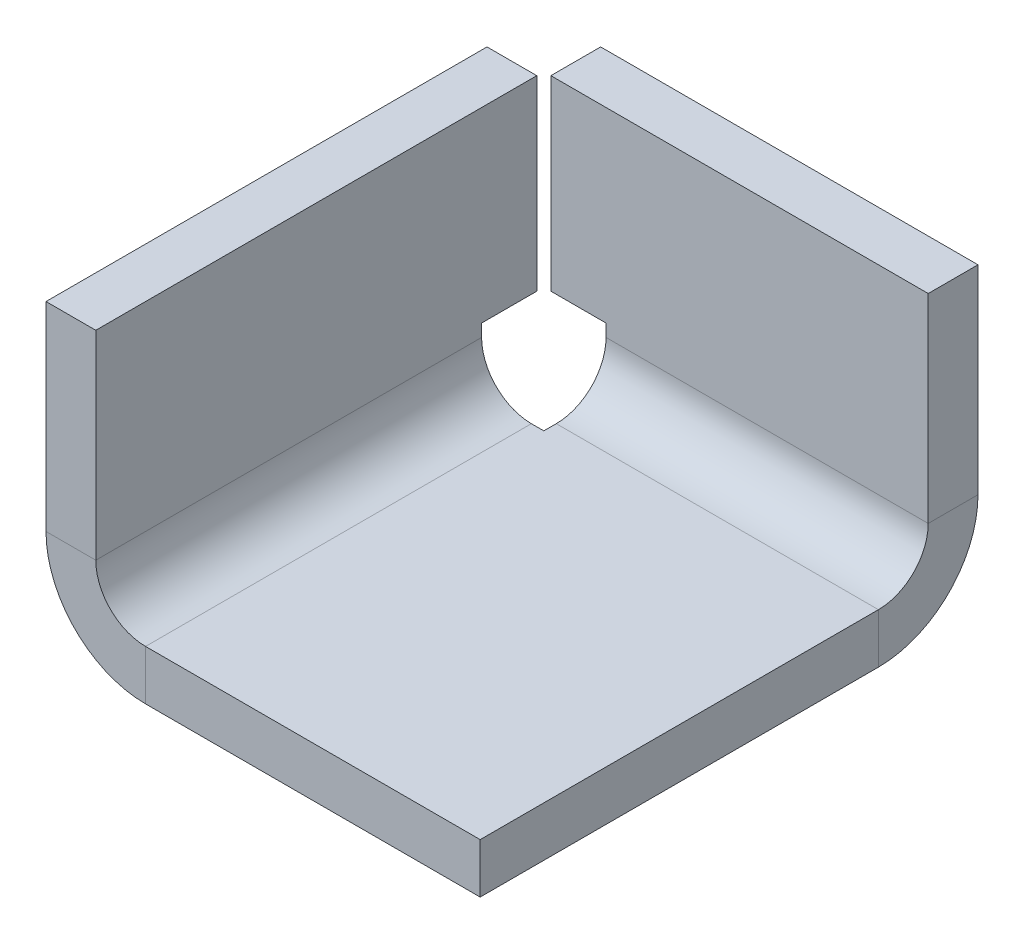
ISO-10303-21;
HEADER;
FILE_DESCRIPTION(('STEP AP214'),'2;1');
FILE_NAME('part.step','',(''),(''),'','','');
FILE_SCHEMA(('AUTOMOTIVE_DESIGN { 1 0 10303 214 1 1 1 1 }'));
ENDSEC;
DATA;
#1=APPLICATION_CONTEXT('core data for automotive mechanical design processes');
#2=APPLICATION_PROTOCOL_DEFINITION('international standard','automotive_design',2000,#1);
#3=PRODUCT_CONTEXT('',#1,'mechanical');
#4=PRODUCT('Part','Part','',(#3));
#5=PRODUCT_RELATED_PRODUCT_CATEGORY('part','',(#4));
#6=PRODUCT_DEFINITION_FORMATION('','',#4);
#7=PRODUCT_DEFINITION_CONTEXT('part definition',#1,'design');
#8=PRODUCT_DEFINITION('design','',#6,#7);
#9=PRODUCT_DEFINITION_SHAPE('','',#8);
#10=(LENGTH_UNIT() NAMED_UNIT(*) SI_UNIT(.MILLI.,.METRE.));
#11=(NAMED_UNIT(*) PLANE_ANGLE_UNIT() SI_UNIT($,.RADIAN.));
#12=(NAMED_UNIT(*) SI_UNIT($,.STERADIAN.) SOLID_ANGLE_UNIT());
#13=UNCERTAINTY_MEASURE_WITH_UNIT(LENGTH_MEASURE(1.E-05),#10,'distance_accuracy_value','');
#14=(GEOMETRIC_REPRESENTATION_CONTEXT(3) GLOBAL_UNCERTAINTY_ASSIGNED_CONTEXT((#13)) GLOBAL_UNIT_ASSIGNED_CONTEXT((#10,
#11,#12)) REPRESENTATION_CONTEXT('',''));
#15=CARTESIAN_POINT('',(0.,0.,0.));
#16=DIRECTION('',(0.,0.,1.));
#17=DIRECTION('',(1.,0.,0.));
#18=AXIS2_PLACEMENT_3D('',#15,#16,#17);
#19=CARTESIAN_POINT('',(22.4999999999999,0.,100.));
#20=DIRECTION('',(1.,0.,0.));
#21=DIRECTION('',(0.,0.,-1.));
#22=AXIS2_PLACEMENT_3D('',#19,#20,#21);
#23=PLANE('',#22);
#24=DIRECTION('',(0.,1.,0.));
#25=VECTOR('',#24,1.);
#26=CARTESIAN_POINT('',(22.4999999999999,0.,20.));
#27=LINE('',#26,#25);
#28=CARTESIAN_POINT('',(22.4999999999999,-10.,20.));
#29=VERTEX_POINT('',#28);
#30=CARTESIAN_POINT('',(22.4999999999999,0.,20.));
#31=VERTEX_POINT('',#30);
#32=EDGE_CURVE('E11',#29,#31,#27,.T.);
#33=ORIENTED_EDGE('',*,*,#32,.F.);
#34=DIRECTION('',(0.,0.,1.));
#35=VECTOR('',#34,1.);
#36=CARTESIAN_POINT('',(22.4999999999999,-10.,100.));
#37=LINE('',#36,#35);
#38=CARTESIAN_POINT('',(22.4999999999999,-10.,22.4999999999999));
#39=VERTEX_POINT('',#38);
#40=EDGE_CURVE('E118',#39,#29,#37,.F.);
#41=ORIENTED_EDGE('',*,*,#40,.F.);
#42=DIRECTION('',(0.,1.,0.));
#43=VECTOR('',#42,1.);
#44=CARTESIAN_POINT('',(22.4999999999999,0.,22.4999999999999));
#45=LINE('',#44,#43);
#46=CARTESIAN_POINT('',(22.4999999999999,0.,22.4999999999999));
#47=VERTEX_POINT('',#46);
#48=EDGE_CURVE('E48',#39,#47,#45,.T.);
#49=ORIENTED_EDGE('',*,*,#48,.T.);
#50=DIRECTION('',(0.,0.,-1.));
#51=VECTOR('',#50,1.);
#52=CARTESIAN_POINT('',(22.4999999999999,0.,100.));
#53=LINE('',#52,#51);
#54=EDGE_CURVE('E121',#47,#31,#53,.T.);
#55=ORIENTED_EDGE('',*,*,#54,.T.);
#56=EDGE_LOOP('',(#33,#41,#49,#55));
#57=FACE_BOUND('',#56,.T.);
#58=ADVANCED_FACE('F38',(#57),#23,.F.);
#59=CARTESIAN_POINT('',(0.,0.,22.4999999999999));
#60=DIRECTION('',(0.,0.,1.));
#61=DIRECTION('',(1.,0.,0.));
#62=AXIS2_PLACEMENT_3D('',#59,#60,#61);
#63=PLANE('',#62);
#64=ORIENTED_EDGE('',*,*,#48,.F.);
#65=DIRECTION('',(1.,0.,0.));
#66=VECTOR('',#65,1.);
#67=CARTESIAN_POINT('',(0.,-10.,22.4999999999999));
#68=LINE('',#67,#66);
#69=CARTESIAN_POINT('',(20.,-10.,22.4999999999999));
#70=VERTEX_POINT('',#69);
#71=EDGE_CURVE('E148',#70,#39,#68,.T.);
#72=ORIENTED_EDGE('',*,*,#71,.F.);
#73=DIRECTION('',(0.,1.,0.));
#74=VECTOR('',#73,1.);
#75=CARTESIAN_POINT('',(20.,0.,22.4999999999999));
#76=LINE('',#75,#74);
#77=CARTESIAN_POINT('',(20.,0.,22.4999999999999));
#78=VERTEX_POINT('',#77);
#79=EDGE_CURVE('E203',#70,#78,#76,.T.);
#80=ORIENTED_EDGE('',*,*,#79,.T.);
#81=DIRECTION('',(1.,0.,0.));
#82=VECTOR('',#81,1.);
#83=CARTESIAN_POINT('',(0.,0.,22.4999999999999));
#84=LINE('',#83,#82);
#85=EDGE_CURVE('E215',#78,#47,#84,.T.);
#86=ORIENTED_EDGE('',*,*,#85,.T.);
#87=EDGE_LOOP('',(#64,#72,#80,#86));
#88=FACE_BOUND('',#87,.T.);
#89=ADVANCED_FACE('F222',(#88),#63,.F.);
#90=CARTESIAN_POINT('',(20.,9.99999999999999,22.4999999999999));
#91=DIRECTION('',(0.,0.,1.));
#92=DIRECTION('',(1.,0.,0.));
#93=AXIS2_PLACEMENT_3D('',#90,#91,#92);
#94=PLANE('',#93);
#95=ORIENTED_EDGE('',*,*,#79,.F.);
#96=CARTESIAN_POINT('',(20.,9.99999999999999,22.4999999999999));
#97=DIRECTION('',(0.,0.,-1.));
#98=DIRECTION('',(-1.,0.,0.));
#99=AXIS2_PLACEMENT_3D('',#96,#97,#98);
#100=CIRCLE('',#99,20.);
#101=CARTESIAN_POINT('',(0.,9.99999999999999,22.4999999999999));
#102=VERTEX_POINT('',#101);
#103=EDGE_CURVE('E279',#70,#102,#100,.T.);
#104=ORIENTED_EDGE('',*,*,#103,.T.);
#105=DIRECTION('',(1.,0.,0.));
#106=VECTOR('',#105,1.);
#107=CARTESIAN_POINT('',(10.,9.99999999999999,22.4999999999999));
#108=LINE('',#107,#106);
#109=CARTESIAN_POINT('',(10.,9.99999999999999,22.4999999999999));
#110=VERTEX_POINT('',#109);
#111=EDGE_CURVE('E200',#102,#110,#108,.T.);
#112=ORIENTED_EDGE('',*,*,#111,.T.);
#113=CARTESIAN_POINT('',(20.,9.99999999999999,22.4999999999999));
#114=DIRECTION('',(0.,0.,-1.));
#115=DIRECTION('',(-1.,0.,0.));
#116=AXIS2_PLACEMENT_3D('',#113,#114,#115);
#117=CIRCLE('',#116,10.);
#118=EDGE_CURVE('E249',#78,#110,#117,.T.);
#119=ORIENTED_EDGE('',*,*,#118,.F.);
#120=EDGE_LOOP('',(#95,#104,#112,#119));
#121=FACE_BOUND('',#120,.T.);
#122=ADVANCED_FACE('F293',(#121),#94,.F.);
#123=CARTESIAN_POINT('',(10.,50.,22.4999999999999));
#124=DIRECTION('',(0.,0.,1.));
#125=DIRECTION('',(0.,1.,0.));
#126=AXIS2_PLACEMENT_3D('',#123,#124,#125);
#127=PLANE('',#126);
#128=ORIENTED_EDGE('',*,*,#111,.F.);
#129=DIRECTION('',(0.,1.,0.));
#130=VECTOR('',#129,1.);
#131=CARTESIAN_POINT('',(0.,50.,22.4999999999999));
#132=LINE('',#131,#130);
#133=CARTESIAN_POINT('',(0.,12.4999999999999,22.4999999999999));
#134=VERTEX_POINT('',#133);
#135=EDGE_CURVE('E287',#102,#134,#132,.T.);
#136=ORIENTED_EDGE('',*,*,#135,.T.);
#137=DIRECTION('',(1.,0.,0.));
#138=VECTOR('',#137,1.);
#139=CARTESIAN_POINT('',(10.,12.4999999999999,22.4999999999999));
#140=LINE('',#139,#138);
#141=CARTESIAN_POINT('',(10.,12.4999999999999,22.4999999999999));
#142=VERTEX_POINT('',#141);
#143=EDGE_CURVE('E197',#134,#142,#140,.T.);
#144=ORIENTED_EDGE('',*,*,#143,.T.);
#145=DIRECTION('',(0.,1.,0.));
#146=VECTOR('',#145,1.);
#147=CARTESIAN_POINT('',(10.,50.,22.4999999999999));
#148=LINE('',#147,#146);
#149=EDGE_CURVE('E223',#110,#142,#148,.T.);
#150=ORIENTED_EDGE('',*,*,#149,.F.);
#151=EDGE_LOOP('',(#128,#136,#144,#150));
#152=FACE_BOUND('',#151,.T.);
#153=ADVANCED_FACE('F307',(#152),#127,.F.);
#154=CARTESIAN_POINT('',(10.,12.4999999999999,100.));
#155=DIRECTION('',(0.,-1.,0.));
#156=DIRECTION('',(0.,0.,1.));
#157=AXIS2_PLACEMENT_3D('',#154,#155,#156);
#158=PLANE('',#157);
#159=ORIENTED_EDGE('',*,*,#143,.F.);
#160=DIRECTION('',(0.,0.,1.));
#161=VECTOR('',#160,1.);
#162=CARTESIAN_POINT('',(0.,12.4999999999999,100.));
#163=LINE('',#162,#161);
#164=CARTESIAN_POINT('',(0.,12.4999999999999,11.4142135623731));
#165=VERTEX_POINT('',#164);
#166=EDGE_CURVE('E284',#165,#134,#163,.T.);
#167=ORIENTED_EDGE('',*,*,#166,.F.);
#168=DIRECTION('',(1.,0.,0.));
#169=VECTOR('',#168,1.);
#170=CARTESIAN_POINT('',(10.,12.4999999999999,11.4142135623731));
#171=LINE('',#170,#169);
#172=CARTESIAN_POINT('',(10.,12.4999999999999,11.4142135623731));
#173=VERTEX_POINT('',#172);
#174=EDGE_CURVE('E194',#165,#173,#171,.T.);
#175=ORIENTED_EDGE('',*,*,#174,.T.);
#176=DIRECTION('',(0.,0.,1.));
#177=VECTOR('',#176,1.);
#178=CARTESIAN_POINT('',(10.,12.4999999999999,100.));
#179=LINE('',#178,#177);
#180=EDGE_CURVE('E226',#173,#142,#179,.T.);
#181=ORIENTED_EDGE('',*,*,#180,.T.);
#182=EDGE_LOOP('',(#159,#167,#175,#181));
#183=FACE_BOUND('',#182,.T.);
#184=ADVANCED_FACE('F373',(#183),#158,.T.);
#185=CARTESIAN_POINT('',(10.,50.,11.4142135623731));
#186=DIRECTION('',(0.,0.,1.));
#187=DIRECTION('',(0.,1.,0.));
#188=AXIS2_PLACEMENT_3D('',#185,#186,#187);
#189=PLANE('',#188);
#190=ORIENTED_EDGE('',*,*,#174,.F.);
#191=DIRECTION('',(0.,1.,0.));
#192=VECTOR('',#191,1.);
#193=CARTESIAN_POINT('',(0.,50.,11.4142135623731));
#194=LINE('',#193,#192);
#195=CARTESIAN_POINT('',(0.,50.,11.4142135623731));
#196=VERTEX_POINT('',#195);
#197=EDGE_CURVE('E266',#165,#196,#194,.T.);
#198=ORIENTED_EDGE('',*,*,#197,.T.);
#199=DIRECTION('',(1.,0.,0.));
#200=VECTOR('',#199,1.);
#201=CARTESIAN_POINT('',(10.,50.,11.4142135623731));
#202=LINE('',#201,#200);
#203=CARTESIAN_POINT('',(10.,50.,11.4142135623731));
#204=VERTEX_POINT('',#203);
#205=EDGE_CURVE('E191',#196,#204,#202,.T.);
#206=ORIENTED_EDGE('',*,*,#205,.T.);
#207=DIRECTION('',(0.,1.,0.));
#208=VECTOR('',#207,1.);
#209=CARTESIAN_POINT('',(10.,50.,11.4142135623731));
#210=LINE('',#209,#208);
#211=EDGE_CURVE('E352',#173,#204,#210,.T.);
#212=ORIENTED_EDGE('',*,*,#211,.F.);
#213=EDGE_LOOP('',(#190,#198,#206,#212));
#214=FACE_BOUND('',#213,.T.);
#215=ADVANCED_FACE('F375',(#214),#189,.F.);
#216=CARTESIAN_POINT('',(10.,50.,100.));
#217=DIRECTION('',(0.,-1.,0.));
#218=DIRECTION('',(0.,0.,1.));
#219=AXIS2_PLACEMENT_3D('',#216,#217,#218);
#220=PLANE('',#219);
#221=ORIENTED_EDGE('',*,*,#205,.F.);
#222=DIRECTION('',(0.,0.,1.));
#223=VECTOR('',#222,1.);
#224=CARTESIAN_POINT('',(0.,50.,100.));
#225=LINE('',#224,#223);
#226=CARTESIAN_POINT('',(0.,50.,100.));
#227=VERTEX_POINT('',#226);
#228=EDGE_CURVE('E154',#227,#196,#225,.F.);
#229=ORIENTED_EDGE('',*,*,#228,.F.);
#230=DIRECTION('',(1.,0.,0.));
#231=VECTOR('',#230,1.);
#232=CARTESIAN_POINT('',(10.,50.,100.));
#233=LINE('',#232,#231);
#234=CARTESIAN_POINT('',(10.,50.,100.));
#235=VERTEX_POINT('',#234);
#236=EDGE_CURVE('E188',#227,#235,#233,.T.);
#237=ORIENTED_EDGE('',*,*,#236,.T.);
#238=DIRECTION('',(0.,0.,1.));
#239=VECTOR('',#238,1.);
#240=CARTESIAN_POINT('',(10.,50.,100.));
#241=LINE('',#240,#239);
#242=EDGE_CURVE('E244',#235,#204,#241,.F.);
#243=ORIENTED_EDGE('',*,*,#242,.T.);
#244=EDGE_LOOP('',(#221,#229,#237,#243));
#245=FACE_BOUND('',#244,.T.);
#246=ADVANCED_FACE('F349',(#245),#220,.F.);
#247=CARTESIAN_POINT('',(10.,50.,100.));
#248=DIRECTION('',(0.,0.,-1.));
#249=DIRECTION('',(0.,-1.,0.));
#250=AXIS2_PLACEMENT_3D('',#247,#248,#249);
#251=PLANE('',#250);
#252=ORIENTED_EDGE('',*,*,#236,.F.);
#253=DIRECTION('',(0.,1.,0.));
#254=VECTOR('',#253,1.);
#255=CARTESIAN_POINT('',(0.,50.,100.));
#256=LINE('',#255,#254);
#257=CARTESIAN_POINT('',(0.,9.99999999999999,100.));
#258=VERTEX_POINT('',#257);
#259=EDGE_CURVE('E157',#227,#258,#256,.F.);
#260=ORIENTED_EDGE('',*,*,#259,.T.);
#261=DIRECTION('',(1.,0.,0.));
#262=VECTOR('',#261,1.);
#263=CARTESIAN_POINT('',(10.,9.99999999999999,100.));
#264=LINE('',#263,#262);
#265=CARTESIAN_POINT('',(10.,9.99999999999999,100.));
#266=VERTEX_POINT('',#265);
#267=EDGE_CURVE('E185',#258,#266,#264,.T.);
#268=ORIENTED_EDGE('',*,*,#267,.T.);
#269=DIRECTION('',(0.,-1.,0.));
#270=VECTOR('',#269,1.);
#271=CARTESIAN_POINT('',(10.,50.,100.));
#272=LINE('',#271,#270);
#273=EDGE_CURVE('E319',#235,#266,#272,.T.);
#274=ORIENTED_EDGE('',*,*,#273,.F.);
#275=EDGE_LOOP('',(#252,#260,#268,#274));
#276=FACE_BOUND('',#275,.T.);
#277=ADVANCED_FACE('F354',(#276),#251,.F.);
#278=CARTESIAN_POINT('',(20.,9.99999999999999,100.));
#279=DIRECTION('',(0.,0.,1.));
#280=DIRECTION('',(1.,0.,0.));
#281=AXIS2_PLACEMENT_3D('',#278,#279,#280);
#282=PLANE('',#281);
#283=ORIENTED_EDGE('',*,*,#267,.F.);
#284=CARTESIAN_POINT('',(20.,9.99999999999999,100.));
#285=DIRECTION('',(0.,0.,-1.));
#286=DIRECTION('',(-1.,0.,0.));
#287=AXIS2_PLACEMENT_3D('',#284,#285,#286);
#288=CIRCLE('',#287,20.);
#289=CARTESIAN_POINT('',(20.,-10.,100.));
#290=VERTEX_POINT('',#289);
#291=EDGE_CURVE('E159',#258,#290,#288,.F.);
#292=ORIENTED_EDGE('',*,*,#291,.T.);
#293=DIRECTION('',(0.,1.,0.));
#294=VECTOR('',#293,1.);
#295=CARTESIAN_POINT('',(20.,0.,100.));
#296=LINE('',#295,#294);
#297=CARTESIAN_POINT('',(20.,0.,100.));
#298=VERTEX_POINT('',#297);
#299=EDGE_CURVE('E56',#290,#298,#296,.T.);
#300=ORIENTED_EDGE('',*,*,#299,.T.);
#301=CARTESIAN_POINT('',(20.,9.99999999999999,100.));
#302=DIRECTION('',(0.,0.,-1.));
#303=DIRECTION('',(-1.,0.,0.));
#304=AXIS2_PLACEMENT_3D('',#301,#302,#303);
#305=CIRCLE('',#304,10.);
#306=EDGE_CURVE('E242',#266,#298,#305,.F.);
#307=ORIENTED_EDGE('',*,*,#306,.F.);
#308=EDGE_LOOP('',(#283,#292,#300,#307));
#309=FACE_BOUND('',#308,.T.);
#310=ADVANCED_FACE('F426',(#309),#282,.T.);
#311=CARTESIAN_POINT('',(0.,0.,100.));
#312=DIRECTION('',(0.,0.,1.));
#313=DIRECTION('',(1.,0.,0.));
#314=AXIS2_PLACEMENT_3D('',#311,#312,#313);
#315=PLANE('',#314);
#316=ORIENTED_EDGE('',*,*,#299,.F.);
#317=DIRECTION('',(1.,0.,0.));
#318=VECTOR('',#317,1.);
#319=CARTESIAN_POINT('',(0.,-10.,100.));
#320=LINE('',#319,#318);
#321=CARTESIAN_POINT('',(87.2139466142265,-10.,100.));
#322=VERTEX_POINT('',#321);
#323=EDGE_CURVE('E272',#290,#322,#320,.T.);
#324=ORIENTED_EDGE('',*,*,#323,.T.);
#325=DIRECTION('',(0.,1.,0.));
#326=VECTOR('',#325,1.);
#327=CARTESIAN_POINT('',(87.2139466142265,0.,100.));
#328=LINE('',#327,#326);
#329=CARTESIAN_POINT('',(87.2139466142265,0.,100.));
#330=VERTEX_POINT('',#329);
#331=EDGE_CURVE('E181',#322,#330,#328,.T.);
#332=ORIENTED_EDGE('',*,*,#331,.T.);
#333=DIRECTION('',(1.,0.,0.));
#334=VECTOR('',#333,1.);
#335=CARTESIAN_POINT('',(0.,0.,100.));
#336=LINE('',#335,#334);
#337=EDGE_CURVE('E357',#298,#330,#336,.T.);
#338=ORIENTED_EDGE('',*,*,#337,.F.);
#339=EDGE_LOOP('',(#316,#324,#332,#338));
#340=FACE_BOUND('',#339,.T.);
#341=ADVANCED_FACE('F436',(#340),#315,.T.);
#342=CARTESIAN_POINT('',(87.2139466142265,0.,100.));
#343=DIRECTION('',(1.,0.,0.));
#344=DIRECTION('',(0.,0.,-1.));
#345=AXIS2_PLACEMENT_3D('',#342,#343,#344);
#346=PLANE('',#345);
#347=ORIENTED_EDGE('',*,*,#331,.F.);
#348=DIRECTION('',(0.,0.,1.));
#349=VECTOR('',#348,1.);
#350=CARTESIAN_POINT('',(87.2139466142265,-10.,100.));
#351=LINE('',#350,#349);
#352=CARTESIAN_POINT('',(87.2139466142265,-10.,20.));
#353=VERTEX_POINT('',#352);
#354=EDGE_CURVE('E274',#322,#353,#351,.F.);
#355=ORIENTED_EDGE('',*,*,#354,.T.);
#356=DIRECTION('',(0.,1.,0.));
#357=VECTOR('',#356,1.);
#358=CARTESIAN_POINT('',(87.2139466142265,0.,20.));
#359=LINE('',#358,#357);
#360=CARTESIAN_POINT('',(87.2139466142265,0.,20.));
#361=VERTEX_POINT('',#360);
#362=EDGE_CURVE('E178',#353,#361,#359,.T.);
#363=ORIENTED_EDGE('',*,*,#362,.T.);
#364=DIRECTION('',(0.,0.,-1.));
#365=VECTOR('',#364,1.);
#366=CARTESIAN_POINT('',(87.2139466142265,0.,100.));
#367=LINE('',#366,#365);
#368=EDGE_CURVE('E355',#330,#361,#367,.T.);
#369=ORIENTED_EDGE('',*,*,#368,.F.);
#370=EDGE_LOOP('',(#347,#355,#363,#369));
#371=FACE_BOUND('',#370,.T.);
#372=ADVANCED_FACE('F446',(#371),#346,.T.);
#373=CARTESIAN_POINT('',(87.2139466142265,9.99999999999999,20.));
#374=DIRECTION('',(-1.,0.,0.));
#375=DIRECTION('',(0.,0.,1.));
#376=AXIS2_PLACEMENT_3D('',#373,#374,#375);
#377=PLANE('',#376);
#378=ORIENTED_EDGE('',*,*,#362,.F.);
#379=CARTESIAN_POINT('',(87.2139466142265,9.99999999999999,20.));
#380=DIRECTION('',(1.,0.,0.));
#381=DIRECTION('',(0.,0.,-1.));
#382=AXIS2_PLACEMENT_3D('',#379,#380,#381);
#383=CIRCLE('',#382,20.);
#384=CARTESIAN_POINT('',(87.2139466142265,9.99999999999999,0.));
#385=VERTEX_POINT('',#384);
#386=EDGE_CURVE('E137',#353,#385,#383,.T.);
#387=ORIENTED_EDGE('',*,*,#386,.T.);
#388=DIRECTION('',(0.,0.,1.));
#389=VECTOR('',#388,1.);
#390=CARTESIAN_POINT('',(87.2139466142265,9.99999999999999,10.));
#391=LINE('',#390,#389);
#392=CARTESIAN_POINT('',(87.2139466142265,9.99999999999999,10.));
#393=VERTEX_POINT('',#392);
#394=EDGE_CURVE('E175',#385,#393,#391,.T.);
#395=ORIENTED_EDGE('',*,*,#394,.T.);
#396=CARTESIAN_POINT('',(87.2139466142265,9.99999999999999,20.));
#397=DIRECTION('',(1.,0.,0.));
#398=DIRECTION('',(0.,0.,-1.));
#399=AXIS2_PLACEMENT_3D('',#396,#397,#398);
#400=CIRCLE('',#399,10.);
#401=EDGE_CURVE('E238',#361,#393,#400,.T.);
#402=ORIENTED_EDGE('',*,*,#401,.F.);
#403=EDGE_LOOP('',(#378,#387,#395,#402));
#404=FACE_BOUND('',#403,.T.);
#405=ADVANCED_FACE('F457',(#404),#377,.F.);
#406=CARTESIAN_POINT('',(87.2139466142265,50.,10.));
#407=DIRECTION('',(1.,0.,0.));
#408=DIRECTION('',(0.,-1.,0.));
#409=AXIS2_PLACEMENT_3D('',#406,#407,#408);
#410=PLANE('',#409);
#411=ORIENTED_EDGE('',*,*,#394,.F.);
#412=DIRECTION('',(0.,1.,0.));
#413=VECTOR('',#412,1.);
#414=CARTESIAN_POINT('',(87.2139466142265,50.,0.));
#415=LINE('',#414,#413);
#416=CARTESIAN_POINT('',(87.2139466142265,50.,0.));
#417=VERTEX_POINT('',#416);
#418=EDGE_CURVE('E270',#417,#385,#415,.F.);
#419=ORIENTED_EDGE('',*,*,#418,.F.);
#420=DIRECTION('',(0.,0.,1.));
#421=VECTOR('',#420,1.);
#422=CARTESIAN_POINT('',(87.2139466142265,50.,10.));
#423=LINE('',#422,#421);
#424=CARTESIAN_POINT('',(87.2139466142265,50.,10.));
#425=VERTEX_POINT('',#424);
#426=EDGE_CURVE('E172',#417,#425,#423,.T.);
#427=ORIENTED_EDGE('',*,*,#426,.T.);
#428=DIRECTION('',(0.,-1.,0.));
#429=VECTOR('',#428,1.);
#430=CARTESIAN_POINT('',(87.2139466142265,50.,10.));
#431=LINE('',#430,#429);
#432=EDGE_CURVE('E362',#425,#393,#431,.T.);
#433=ORIENTED_EDGE('',*,*,#432,.T.);
#434=EDGE_LOOP('',(#411,#419,#427,#433));
#435=FACE_BOUND('',#434,.T.);
#436=ADVANCED_FACE('F468',(#435),#410,.T.);
#437=CARTESIAN_POINT('',(10.,50.,10.));
#438=DIRECTION('',(0.,-1.,0.));
#439=DIRECTION('',(-1.,0.,0.));
#440=AXIS2_PLACEMENT_3D('',#437,#438,#439);
#441=PLANE('',#440);
#442=ORIENTED_EDGE('',*,*,#426,.F.);
#443=DIRECTION('',(-1.,0.,0.));
#444=VECTOR('',#443,1.);
#445=CARTESIAN_POINT('',(10.,50.,0.));
#446=LINE('',#445,#444);
#447=CARTESIAN_POINT('',(11.4142135623731,50.,0.));
#448=VERTEX_POINT('',#447);
#449=EDGE_CURVE('E267',#448,#417,#446,.F.);
#450=ORIENTED_EDGE('',*,*,#449,.F.);
#451=DIRECTION('',(0.,0.,1.));
#452=VECTOR('',#451,1.);
#453=CARTESIAN_POINT('',(11.4142135623731,50.,10.));
#454=LINE('',#453,#452);
#455=CARTESIAN_POINT('',(11.4142135623731,50.,10.));
#456=VERTEX_POINT('',#455);
#457=EDGE_CURVE('E169',#448,#456,#454,.T.);
#458=ORIENTED_EDGE('',*,*,#457,.T.);
#459=DIRECTION('',(-1.,0.,0.));
#460=VECTOR('',#459,1.);
#461=CARTESIAN_POINT('',(10.,50.,10.));
#462=LINE('',#461,#460);
#463=EDGE_CURVE('E365',#456,#425,#462,.F.);
#464=ORIENTED_EDGE('',*,*,#463,.T.);
#465=EDGE_LOOP('',(#442,#450,#458,#464));
#466=FACE_BOUND('',#465,.T.);
#467=ADVANCED_FACE('F479',(#466),#441,.F.);
#468=CARTESIAN_POINT('',(11.4142135623731,0.,10.));
#469=DIRECTION('',(1.,0.,0.));
#470=DIRECTION('',(0.,-1.,0.));
#471=AXIS2_PLACEMENT_3D('',#468,#469,#470);
#472=PLANE('',#471);
#473=ORIENTED_EDGE('',*,*,#457,.F.);
#474=DIRECTION('',(0.,1.,0.));
#475=VECTOR('',#474,1.);
#476=CARTESIAN_POINT('',(11.4142135623731,50.,0.));
#477=LINE('',#476,#475);
#478=CARTESIAN_POINT('',(11.4142135623731,12.4999999999999,0.));
#479=VERTEX_POINT('',#478);
#480=EDGE_CURVE('E263',#448,#479,#477,.F.);
#481=ORIENTED_EDGE('',*,*,#480,.T.);
#482=DIRECTION('',(0.,0.,1.));
#483=VECTOR('',#482,1.);
#484=CARTESIAN_POINT('',(11.4142135623731,12.4999999999999,10.));
#485=LINE('',#484,#483);
#486=CARTESIAN_POINT('',(11.4142135623731,12.4999999999999,10.));
#487=VERTEX_POINT('',#486);
#488=EDGE_CURVE('E166',#479,#487,#485,.T.);
#489=ORIENTED_EDGE('',*,*,#488,.T.);
#490=DIRECTION('',(0.,-1.,0.));
#491=VECTOR('',#490,1.);
#492=CARTESIAN_POINT('',(11.4142135623731,0.,10.));
#493=LINE('',#492,#491);
#494=EDGE_CURVE('E368',#456,#487,#493,.T.);
#495=ORIENTED_EDGE('',*,*,#494,.F.);
#496=EDGE_LOOP('',(#473,#481,#489,#495));
#497=FACE_BOUND('',#496,.T.);
#498=ADVANCED_FACE('F490',(#497),#472,.F.);
#499=CARTESIAN_POINT('',(10.,12.4999999999999,10.));
#500=DIRECTION('',(0.,-1.,0.));
#501=DIRECTION('',(-1.,0.,0.));
#502=AXIS2_PLACEMENT_3D('',#499,#500,#501);
#503=PLANE('',#502);
#504=ORIENTED_EDGE('',*,*,#488,.F.);
#505=DIRECTION('',(-1.,0.,0.));
#506=VECTOR('',#505,1.);
#507=CARTESIAN_POINT('',(10.,12.4999999999999,0.));
#508=LINE('',#507,#506);
#509=CARTESIAN_POINT('',(22.4999999999999,12.4999999999999,0.));
#510=VERTEX_POINT('',#509);
#511=EDGE_CURVE('E149',#510,#479,#508,.T.);
#512=ORIENTED_EDGE('',*,*,#511,.F.);
#513=DIRECTION('',(0.,0.,1.));
#514=VECTOR('',#513,1.);
#515=CARTESIAN_POINT('',(22.4999999999999,12.4999999999999,10.));
#516=LINE('',#515,#514);
#517=CARTESIAN_POINT('',(22.4999999999999,12.4999999999999,10.));
#518=VERTEX_POINT('',#517);
#519=EDGE_CURVE('E163',#510,#518,#516,.T.);
#520=ORIENTED_EDGE('',*,*,#519,.T.);
#521=DIRECTION('',(-1.,0.,0.));
#522=VECTOR('',#521,1.);
#523=CARTESIAN_POINT('',(10.,12.4999999999999,10.));
#524=LINE('',#523,#522);
#525=EDGE_CURVE('E220',#518,#487,#524,.T.);
#526=ORIENTED_EDGE('',*,*,#525,.T.);
#527=EDGE_LOOP('',(#504,#512,#520,#526));
#528=FACE_BOUND('',#527,.T.);
#529=ADVANCED_FACE('F501',(#528),#503,.T.);
#530=CARTESIAN_POINT('',(22.4999999999999,50.,10.));
#531=DIRECTION('',(1.,0.,0.));
#532=DIRECTION('',(0.,-1.,0.));
#533=AXIS2_PLACEMENT_3D('',#530,#531,#532);
#534=PLANE('',#533);
#535=ORIENTED_EDGE('',*,*,#519,.F.);
#536=DIRECTION('',(0.,1.,0.));
#537=VECTOR('',#536,1.);
#538=CARTESIAN_POINT('',(22.4999999999999,50.,0.));
#539=LINE('',#538,#537);
#540=CARTESIAN_POINT('',(22.4999999999999,9.99999999999999,0.));
#541=VERTEX_POINT('',#540);
#542=EDGE_CURVE('E254',#510,#541,#539,.F.);
#543=ORIENTED_EDGE('',*,*,#542,.T.);
#544=DIRECTION('',(0.,0.,1.));
#545=VECTOR('',#544,1.);
#546=CARTESIAN_POINT('',(22.4999999999999,9.99999999999999,10.));
#547=LINE('',#546,#545);
#548=CARTESIAN_POINT('',(22.4999999999999,9.99999999999999,10.));
#549=VERTEX_POINT('',#548);
#550=EDGE_CURVE('E42',#541,#549,#547,.T.);
#551=ORIENTED_EDGE('',*,*,#550,.T.);
#552=DIRECTION('',(0.,-1.,0.));
#553=VECTOR('',#552,1.);
#554=CARTESIAN_POINT('',(22.4999999999999,50.,10.));
#555=LINE('',#554,#553);
#556=EDGE_CURVE('E230',#518,#549,#555,.T.);
#557=ORIENTED_EDGE('',*,*,#556,.F.);
#558=EDGE_LOOP('',(#535,#543,#551,#557));
#559=FACE_BOUND('',#558,.T.);
#560=ADVANCED_FACE('F512',(#559),#534,.F.);
#561=CARTESIAN_POINT('',(22.4999999999999,9.99999999999999,20.));
#562=DIRECTION('',(1.,0.,0.));
#563=DIRECTION('',(0.,0.,-1.));
#564=AXIS2_PLACEMENT_3D('',#561,#562,#563);
#565=PLANE('',#564);
#566=CARTESIAN_POINT('',(22.4999999999999,9.99999999999999,20.));
#567=DIRECTION('',(1.,0.,0.));
#568=DIRECTION('',(0.,0.,-1.));
#569=AXIS2_PLACEMENT_3D('',#566,#567,#568);
#570=CIRCLE('',#569,20.);
#571=EDGE_CURVE('E134',#541,#29,#570,.F.);
#572=ORIENTED_EDGE('',*,*,#571,.T.);
#573=ORIENTED_EDGE('',*,*,#32,.T.);
#574=CARTESIAN_POINT('',(22.4999999999999,9.99999999999999,20.));
#575=DIRECTION('',(-1.,0.,0.));
#576=DIRECTION('',(0.,0.,1.));
#577=AXIS2_PLACEMENT_3D('',#574,#575,#576);
#578=CIRCLE('',#577,10.);
#579=EDGE_CURVE('E241',#549,#31,#578,.T.);
#580=ORIENTED_EDGE('',*,*,#579,.F.);
#581=ORIENTED_EDGE('',*,*,#550,.F.);
#582=EDGE_LOOP('',(#572,#573,#580,#581));
#583=FACE_BOUND('',#582,.T.);
#584=ADVANCED_FACE('F40',(#583),#565,.F.);
#585=CARTESIAN_POINT('',(10.,50.,10.));
#586=DIRECTION('',(0.,0.,-1.));
#587=DIRECTION('',(-1.,0.,0.));
#588=AXIS2_PLACEMENT_3D('',#585,#586,#587);
#589=PLANE('',#588);
#590=ORIENTED_EDGE('',*,*,#556,.T.);
#591=DIRECTION('',(1.,0.,0.));
#592=VECTOR('',#591,1.);
#593=CARTESIAN_POINT('',(10.,9.99999999999999,10.));
#594=LINE('',#593,#592);
#595=EDGE_CURVE('E233',#549,#393,#594,.T.);
#596=ORIENTED_EDGE('',*,*,#595,.T.);
#597=ORIENTED_EDGE('',*,*,#432,.F.);
#598=ORIENTED_EDGE('',*,*,#463,.F.);
#599=ORIENTED_EDGE('',*,*,#494,.T.);
#600=ORIENTED_EDGE('',*,*,#525,.F.);
#601=EDGE_LOOP('',(#590,#596,#597,#598,#599,#600));
#602=FACE_BOUND('',#601,.T.);
#603=ADVANCED_FACE('F533',(#602),#589,.F.);
#604=CARTESIAN_POINT('',(0.,0.,100.));
#605=DIRECTION('',(0.,1.,0.));
#606=DIRECTION('',(0.,0.,1.));
#607=AXIS2_PLACEMENT_3D('',#604,#605,#606);
#608=PLANE('',#607);
#609=ORIENTED_EDGE('',*,*,#85,.F.);
#610=DIRECTION('',(0.,0.,-1.));
#611=VECTOR('',#610,1.);
#612=CARTESIAN_POINT('',(20.,0.,100.));
#613=LINE('',#612,#611);
#614=EDGE_CURVE('E247',#78,#298,#613,.F.);
#615=ORIENTED_EDGE('',*,*,#614,.T.);
#616=ORIENTED_EDGE('',*,*,#337,.T.);
#617=ORIENTED_EDGE('',*,*,#368,.T.);
#618=DIRECTION('',(1.,0.,0.));
#619=VECTOR('',#618,1.);
#620=CARTESIAN_POINT('',(0.,0.,20.));
#621=LINE('',#620,#619);
#622=EDGE_CURVE('E219',#361,#31,#621,.F.);
#623=ORIENTED_EDGE('',*,*,#622,.T.);
#624=ORIENTED_EDGE('',*,*,#54,.F.);
#625=EDGE_LOOP('',(#609,#615,#616,#617,#623,#624));
#626=FACE_BOUND('',#625,.T.);
#627=ADVANCED_FACE('F213',(#626),#608,.T.);
#628=CARTESIAN_POINT('',(10.,50.,100.));
#629=DIRECTION('',(-1.,0.,0.));
#630=DIRECTION('',(0.,0.,1.));
#631=AXIS2_PLACEMENT_3D('',#628,#629,#630);
#632=PLANE('',#631);
#633=ORIENTED_EDGE('',*,*,#273,.T.);
#634=DIRECTION('',(0.,0.,-1.));
#635=VECTOR('',#634,1.);
#636=CARTESIAN_POINT('',(10.,9.99999999999999,100.));
#637=LINE('',#636,#635);
#638=EDGE_CURVE('E237',#266,#110,#637,.T.);
#639=ORIENTED_EDGE('',*,*,#638,.T.);
#640=ORIENTED_EDGE('',*,*,#149,.T.);
#641=ORIENTED_EDGE('',*,*,#180,.F.);
#642=ORIENTED_EDGE('',*,*,#211,.T.);
#643=ORIENTED_EDGE('',*,*,#242,.F.);
#644=EDGE_LOOP('',(#633,#639,#640,#641,#642,#643));
#645=FACE_BOUND('',#644,.T.);
#646=ADVANCED_FACE('F316',(#645),#632,.F.);
#647=CARTESIAN_POINT('',(10.,9.99999999999999,20.));
#648=DIRECTION('',(1.,0.,0.));
#649=DIRECTION('',(0.,0.,-1.));
#650=AXIS2_PLACEMENT_3D('',#647,#648,#649);
#651=CYLINDRICAL_SURFACE('',#650,10.);
#652=ORIENTED_EDGE('',*,*,#579,.T.);
#653=ORIENTED_EDGE('',*,*,#622,.F.);
#654=ORIENTED_EDGE('',*,*,#401,.T.);
#655=ORIENTED_EDGE('',*,*,#595,.F.);
#656=EDGE_LOOP('',(#652,#653,#654,#655));
#657=FACE_BOUND('',#656,.T.);
#658=ADVANCED_FACE('F561',(#657),#651,.F.);
#659=CARTESIAN_POINT('',(20.,9.99999999999999,100.));
#660=DIRECTION('',(0.,0.,-1.));
#661=DIRECTION('',(-1.,0.,0.));
#662=AXIS2_PLACEMENT_3D('',#659,#660,#661);
#663=CYLINDRICAL_SURFACE('',#662,10.);
#664=ORIENTED_EDGE('',*,*,#306,.T.);
#665=ORIENTED_EDGE('',*,*,#614,.F.);
#666=ORIENTED_EDGE('',*,*,#118,.T.);
#667=ORIENTED_EDGE('',*,*,#638,.F.);
#668=EDGE_LOOP('',(#664,#665,#666,#667));
#669=FACE_BOUND('',#668,.T.);
#670=ADVANCED_FACE('F321',(#669),#663,.F.);
#671=CARTESIAN_POINT('',(10.,50.,0.));
#672=DIRECTION('',(0.,0.,-1.));
#673=DIRECTION('',(-1.,0.,0.));
#674=AXIS2_PLACEMENT_3D('',#671,#672,#673);
#675=PLANE('',#674);
#676=ORIENTED_EDGE('',*,*,#542,.F.);
#677=ORIENTED_EDGE('',*,*,#511,.T.);
#678=ORIENTED_EDGE('',*,*,#480,.F.);
#679=ORIENTED_EDGE('',*,*,#449,.T.);
#680=ORIENTED_EDGE('',*,*,#418,.T.);
#681=DIRECTION('',(-1.,0.,0.));
#682=VECTOR('',#681,1.);
#683=CARTESIAN_POINT('',(10.,9.99999999999999,0.));
#684=LINE('',#683,#682);
#685=EDGE_CURVE('E142',#541,#385,#684,.F.);
#686=ORIENTED_EDGE('',*,*,#685,.F.);
#687=EDGE_LOOP('',(#676,#677,#678,#679,#680,#686));
#688=FACE_BOUND('',#687,.T.);
#689=ADVANCED_FACE('F581',(#688),#675,.T.);
#690=CARTESIAN_POINT('',(0.,-10.,100.));
#691=DIRECTION('',(0.,1.,0.));
#692=DIRECTION('',(0.,0.,1.));
#693=AXIS2_PLACEMENT_3D('',#690,#691,#692);
#694=PLANE('',#693);
#695=ORIENTED_EDGE('',*,*,#71,.T.);
#696=ORIENTED_EDGE('',*,*,#40,.T.);
#697=DIRECTION('',(1.,0.,0.));
#698=VECTOR('',#697,1.);
#699=CARTESIAN_POINT('',(0.,-10.,20.));
#700=LINE('',#699,#698);
#701=EDGE_CURVE('E131',#353,#29,#700,.F.);
#702=ORIENTED_EDGE('',*,*,#701,.F.);
#703=ORIENTED_EDGE('',*,*,#354,.F.);
#704=ORIENTED_EDGE('',*,*,#323,.F.);
#705=DIRECTION('',(0.,0.,1.));
#706=VECTOR('',#705,1.);
#707=CARTESIAN_POINT('',(20.,-10.,100.));
#708=LINE('',#707,#706);
#709=EDGE_CURVE('E252',#70,#290,#708,.T.);
#710=ORIENTED_EDGE('',*,*,#709,.F.);
#711=EDGE_LOOP('',(#695,#696,#702,#703,#704,#710));
#712=FACE_BOUND('',#711,.T.);
#713=ADVANCED_FACE('F145',(#712),#694,.F.);
#714=CARTESIAN_POINT('',(0.,50.,100.));
#715=DIRECTION('',(-1.,0.,0.));
#716=DIRECTION('',(0.,0.,1.));
#717=AXIS2_PLACEMENT_3D('',#714,#715,#716);
#718=PLANE('',#717);
#719=ORIENTED_EDGE('',*,*,#259,.F.);
#720=ORIENTED_EDGE('',*,*,#228,.T.);
#721=ORIENTED_EDGE('',*,*,#197,.F.);
#722=ORIENTED_EDGE('',*,*,#166,.T.);
#723=ORIENTED_EDGE('',*,*,#135,.F.);
#724=DIRECTION('',(0.,0.,1.));
#725=VECTOR('',#724,1.);
#726=CARTESIAN_POINT('',(0.,9.99999999999999,100.));
#727=LINE('',#726,#725);
#728=EDGE_CURVE('E141',#258,#102,#727,.F.);
#729=ORIENTED_EDGE('',*,*,#728,.F.);
#730=EDGE_LOOP('',(#719,#720,#721,#722,#723,#729));
#731=FACE_BOUND('',#730,.T.);
#732=ADVANCED_FACE('F303',(#731),#718,.T.);
#733=CARTESIAN_POINT('',(10.,9.99999999999999,20.));
#734=DIRECTION('',(1.,0.,0.));
#735=DIRECTION('',(0.,0.,-1.));
#736=AXIS2_PLACEMENT_3D('',#733,#734,#735);
#737=CYLINDRICAL_SURFACE('',#736,20.);
#738=ORIENTED_EDGE('',*,*,#571,.F.);
#739=ORIENTED_EDGE('',*,*,#685,.T.);
#740=ORIENTED_EDGE('',*,*,#386,.F.);
#741=ORIENTED_EDGE('',*,*,#701,.T.);
#742=EDGE_LOOP('',(#738,#739,#740,#741));
#743=FACE_BOUND('',#742,.T.);
#744=ADVANCED_FACE('F132',(#743),#737,.T.);
#745=CARTESIAN_POINT('',(20.,9.99999999999999,100.));
#746=DIRECTION('',(0.,0.,-1.));
#747=DIRECTION('',(-1.,0.,0.));
#748=AXIS2_PLACEMENT_3D('',#745,#746,#747);
#749=CYLINDRICAL_SURFACE('',#748,20.);
#750=ORIENTED_EDGE('',*,*,#291,.F.);
#751=ORIENTED_EDGE('',*,*,#728,.T.);
#752=ORIENTED_EDGE('',*,*,#103,.F.);
#753=ORIENTED_EDGE('',*,*,#709,.T.);
#754=EDGE_LOOP('',(#750,#751,#752,#753));
#755=FACE_BOUND('',#754,.T.);
#756=ADVANCED_FACE('F297',(#755),#749,.T.);
#757=CLOSED_SHELL('',(#58,#89,#122,#153,#184,#215,#246,#277,#310,#341,#372,#405,#436,#467,#498,
#529,#560,#584,#603,#627,#646,#658,#670,#689,#713,#732,#744,#756));
#758=MANIFOLD_SOLID_BREP('B2',#757);
#759=ADVANCED_BREP_SHAPE_REPRESENTATION('',(#18,#758),#14);
#760=SHAPE_DEFINITION_REPRESENTATION(#9,#759);
ENDSEC;
END-ISO-10303-21;
